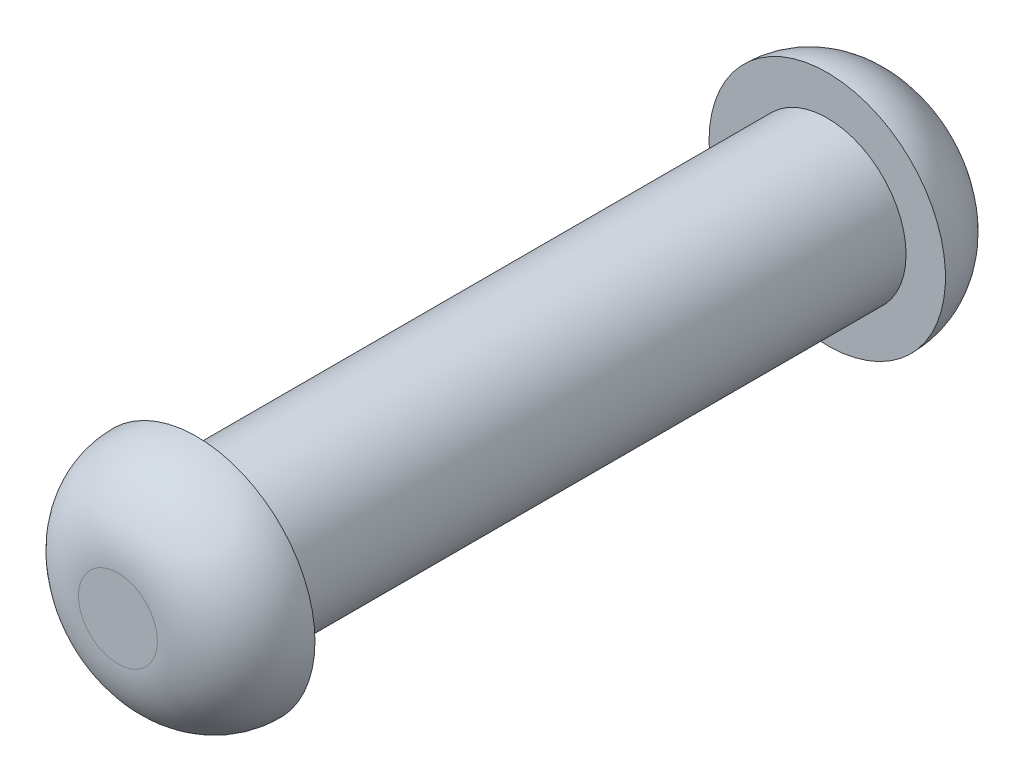
ISO-10303-21;
HEADER;
FILE_DESCRIPTION(('STEP AP214'),'2;1');
FILE_NAME('part.step','',(''),(''),'','','');
FILE_SCHEMA(('AUTOMOTIVE_DESIGN { 1 0 10303 214 1 1 1 1 }'));
ENDSEC;
DATA;
#1=APPLICATION_CONTEXT('core data for automotive mechanical design processes');
#2=APPLICATION_PROTOCOL_DEFINITION('international standard','automotive_design',2000,#1);
#3=PRODUCT_CONTEXT('',#1,'mechanical');
#4=PRODUCT('Part','Part','',(#3));
#5=PRODUCT_RELATED_PRODUCT_CATEGORY('part','',(#4));
#6=PRODUCT_DEFINITION_FORMATION('','',#4);
#7=PRODUCT_DEFINITION_CONTEXT('part definition',#1,'design');
#8=PRODUCT_DEFINITION('design','',#6,#7);
#9=PRODUCT_DEFINITION_SHAPE('','',#8);
#10=(LENGTH_UNIT() NAMED_UNIT(*) SI_UNIT(.MILLI.,.METRE.));
#11=(NAMED_UNIT(*) PLANE_ANGLE_UNIT() SI_UNIT($,.RADIAN.));
#12=(NAMED_UNIT(*) SI_UNIT($,.STERADIAN.) SOLID_ANGLE_UNIT());
#13=UNCERTAINTY_MEASURE_WITH_UNIT(LENGTH_MEASURE(1.E-05),#10,'distance_accuracy_value','');
#14=(GEOMETRIC_REPRESENTATION_CONTEXT(3) GLOBAL_UNCERTAINTY_ASSIGNED_CONTEXT((#13)) GLOBAL_UNIT_ASSIGNED_CONTEXT((#10,
#11,#12)) REPRESENTATION_CONTEXT('',''));
#15=CARTESIAN_POINT('',(0.,0.,0.));
#16=DIRECTION('',(0.,0.,1.));
#17=DIRECTION('',(1.,0.,0.));
#18=AXIS2_PLACEMENT_3D('',#15,#16,#17);
#19=CARTESIAN_POINT('',(0.,0.,40.));
#20=DIRECTION('',(0.,0.,-1.));
#21=DIRECTION('',(-1.,0.,0.));
#22=AXIS2_PLACEMENT_3D('',#19,#20,#21);
#23=CYLINDRICAL_SURFACE('',#22,5.);
#24=CARTESIAN_POINT('',(0.,0.,40.));
#25=DIRECTION('',(0.,0.,1.));
#26=DIRECTION('',(1.,0.,0.));
#27=AXIS2_PLACEMENT_3D('',#24,#25,#26);
#28=CIRCLE('',#27,5.);
#29=CARTESIAN_POINT('',(5.,0.,40.));
#30=VERTEX_POINT('',#29);
#31=EDGE_CURVE('E42',#30,#30,#28,.T.);
#32=ORIENTED_EDGE('',*,*,#31,.F.);
#33=EDGE_LOOP('',(#32));
#34=FACE_BOUND('',#33,.T.);
#35=CARTESIAN_POINT('',(0.,0.,0.));
#36=DIRECTION('',(0.,0.,1.));
#37=DIRECTION('',(1.,0.,0.));
#38=AXIS2_PLACEMENT_3D('',#35,#36,#37);
#39=CIRCLE('',#38,5.);
#40=CARTESIAN_POINT('',(5.,0.,0.));
#41=VERTEX_POINT('',#40);
#42=EDGE_CURVE('E49',#41,#41,#39,.T.);
#43=ORIENTED_EDGE('',*,*,#42,.T.);
#44=EDGE_LOOP('',(#43));
#45=FACE_BOUND('',#44,.T.);
#46=ADVANCED_FACE('F31',(#34,#45),#23,.T.);
#47=CARTESIAN_POINT('',(0.,0.,45.));
#48=DIRECTION('',(0.,0.,1.));
#49=DIRECTION('',(1.,0.,0.));
#50=AXIS2_PLACEMENT_3D('',#47,#48,#49);
#51=PLANE('',#50);
#52=CARTESIAN_POINT('',(0.,0.,45.));
#53=DIRECTION('',(0.,0.,1.));
#54=DIRECTION('',(1.,0.,0.));
#55=AXIS2_PLACEMENT_3D('',#52,#53,#54);
#56=CIRCLE('',#55,2.5);
#57=CARTESIAN_POINT('',(2.5,0.,45.));
#58=VERTEX_POINT('',#57);
#59=EDGE_CURVE('E38',#58,#58,#56,.T.);
#60=ORIENTED_EDGE('',*,*,#59,.T.);
#61=EDGE_LOOP('',(#60));
#62=FACE_BOUND('',#61,.T.);
#63=ADVANCED_FACE('F74',(#62),#51,.T.);
#64=CARTESIAN_POINT('',(0.,0.,40.));
#65=DIRECTION('',(0.,0.,1.));
#66=DIRECTION('',(1.,0.,0.));
#67=AXIS2_PLACEMENT_3D('',#64,#65,#66);
#68=PLANE('',#67);
#69=ORIENTED_EDGE('',*,*,#31,.T.);
#70=EDGE_LOOP('',(#69));
#71=FACE_BOUND('',#70,.T.);
#72=CARTESIAN_POINT('',(0.,0.,40.));
#73=DIRECTION('',(0.,0.,1.));
#74=DIRECTION('',(1.,0.,0.));
#75=AXIS2_PLACEMENT_3D('',#72,#73,#74);
#76=CIRCLE('',#75,7.5);
#77=CARTESIAN_POINT('',(7.5,0.,40.));
#78=VERTEX_POINT('',#77);
#79=EDGE_CURVE('E46',#78,#78,#76,.T.);
#80=ORIENTED_EDGE('',*,*,#79,.F.);
#81=EDGE_LOOP('',(#80));
#82=FACE_BOUND('',#81,.T.);
#83=ADVANCED_FACE('F80',(#71,#82),#68,.F.);
#84=CARTESIAN_POINT('',(0.,0.,40.));
#85=DIRECTION('',(0.,0.,1.));
#86=DIRECTION('',(1.,0.,0.));
#87=AXIS2_PLACEMENT_3D('',#84,#85,#86);
#88=DEGENERATE_TOROIDAL_SURFACE('',#87,2.5,5.,.T.);
#89=ORIENTED_EDGE('',*,*,#79,.T.);
#90=EDGE_LOOP('',(#89));
#91=FACE_BOUND('',#90,.T.);
#92=ORIENTED_EDGE('',*,*,#59,.F.);
#93=EDGE_LOOP('',(#92));
#94=FACE_BOUND('',#93,.T.);
#95=ADVANCED_FACE('F69',(#91,#94),#88,.T.);
#96=CARTESIAN_POINT('',(0.,0.,-5.));
#97=DIRECTION('',(0.,0.,-1.));
#98=DIRECTION('',(-1.,0.,0.));
#99=AXIS2_PLACEMENT_3D('',#96,#97,#98);
#100=PLANE('',#99);
#101=CARTESIAN_POINT('',(0.,0.,-5.));
#102=DIRECTION('',(0.,0.,-1.));
#103=DIRECTION('',(-1.,0.,0.));
#104=AXIS2_PLACEMENT_3D('',#101,#102,#103);
#105=CIRCLE('',#104,2.5);
#106=CARTESIAN_POINT('',(-2.5,0.,-5.));
#107=VERTEX_POINT('',#106);
#108=EDGE_CURVE('E10',#107,#107,#105,.T.);
#109=ORIENTED_EDGE('',*,*,#108,.T.);
#110=EDGE_LOOP('',(#109));
#111=FACE_BOUND('',#110,.T.);
#112=ADVANCED_FACE('F62',(#111),#100,.T.);
#113=CARTESIAN_POINT('',(0.,0.,0.));
#114=DIRECTION('',(0.,0.,-1.));
#115=DIRECTION('',(-1.,0.,0.));
#116=AXIS2_PLACEMENT_3D('',#113,#114,#115);
#117=PLANE('',#116);
#118=ORIENTED_EDGE('',*,*,#42,.F.);
#119=EDGE_LOOP('',(#118));
#120=FACE_BOUND('',#119,.T.);
#121=CARTESIAN_POINT('',(0.,0.,0.));
#122=DIRECTION('',(0.,0.,-1.));
#123=DIRECTION('',(-1.,0.,0.));
#124=AXIS2_PLACEMENT_3D('',#121,#122,#123);
#125=CIRCLE('',#124,7.5);
#126=CARTESIAN_POINT('',(-7.5,0.,0.));
#127=VERTEX_POINT('',#126);
#128=EDGE_CURVE('E51',#127,#127,#125,.T.);
#129=ORIENTED_EDGE('',*,*,#128,.F.);
#130=EDGE_LOOP('',(#129));
#131=FACE_BOUND('',#130,.T.);
#132=ADVANCED_FACE('F60',(#120,#131),#117,.F.);
#133=CARTESIAN_POINT('',(0.,0.,0.));
#134=DIRECTION('',(0.,0.,-1.));
#135=DIRECTION('',(-1.,0.,0.));
#136=AXIS2_PLACEMENT_3D('',#133,#134,#135);
#137=DEGENERATE_TOROIDAL_SURFACE('',#136,2.5,5.,.T.);
#138=ORIENTED_EDGE('',*,*,#128,.T.);
#139=EDGE_LOOP('',(#138));
#140=FACE_BOUND('',#139,.T.);
#141=ORIENTED_EDGE('',*,*,#108,.F.);
#142=EDGE_LOOP('',(#141));
#143=FACE_BOUND('',#142,.T.);
#144=ADVANCED_FACE('F33',(#140,#143),#137,.T.);
#145=CLOSED_SHELL('',(#46,#63,#83,#95,#112,#132,#144));
#146=MANIFOLD_SOLID_BREP('B2',#145);
#147=ADVANCED_BREP_SHAPE_REPRESENTATION('',(#18,#146),#14);
#148=SHAPE_DEFINITION_REPRESENTATION(#9,#147);
ENDSEC;
END-ISO-10303-21;
